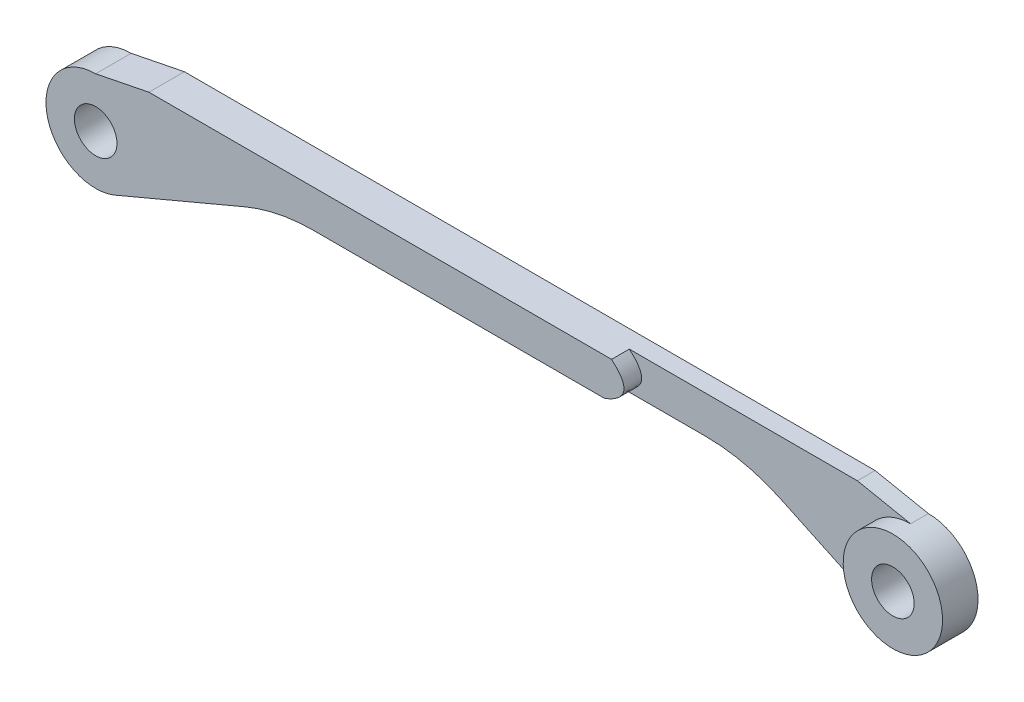
ISO-10303-21;
HEADER;
FILE_DESCRIPTION(('STEP AP214'),'2;1');
FILE_NAME('part.step','',(''),(''),'','','');
FILE_SCHEMA(('AUTOMOTIVE_DESIGN { 1 0 10303 214 1 1 1 1 }'));
ENDSEC;
DATA;
#1=APPLICATION_CONTEXT('core data for automotive mechanical design processes');
#2=APPLICATION_PROTOCOL_DEFINITION('international standard','automotive_design',2000,#1);
#3=PRODUCT_CONTEXT('',#1,'mechanical');
#4=PRODUCT('Part','Part','',(#3));
#5=PRODUCT_RELATED_PRODUCT_CATEGORY('part','',(#4));
#6=PRODUCT_DEFINITION_FORMATION('','',#4);
#7=PRODUCT_DEFINITION_CONTEXT('part definition',#1,'design');
#8=PRODUCT_DEFINITION('design','',#6,#7);
#9=PRODUCT_DEFINITION_SHAPE('','',#8);
#10=(LENGTH_UNIT() NAMED_UNIT(*) SI_UNIT(.MILLI.,.METRE.));
#11=(NAMED_UNIT(*) PLANE_ANGLE_UNIT() SI_UNIT($,.RADIAN.));
#12=(NAMED_UNIT(*) SI_UNIT($,.STERADIAN.) SOLID_ANGLE_UNIT());
#13=UNCERTAINTY_MEASURE_WITH_UNIT(LENGTH_MEASURE(1.E-05),#10,'distance_accuracy_value','');
#14=(GEOMETRIC_REPRESENTATION_CONTEXT(3) GLOBAL_UNCERTAINTY_ASSIGNED_CONTEXT((#13)) GLOBAL_UNIT_ASSIGNED_CONTEXT((#10,
#11,#12)) REPRESENTATION_CONTEXT('',''));
#15=CARTESIAN_POINT('',(0.,0.,0.));
#16=DIRECTION('',(0.,0.,1.));
#17=DIRECTION('',(1.,0.,0.));
#18=AXIS2_PLACEMENT_3D('',#15,#16,#17);
#19=CARTESIAN_POINT('',(-57.845130198065,-43.5295238724371,5.));
#20=DIRECTION('',(0.,0.,1.));
#21=DIRECTION('',(1.,0.,0.));
#22=AXIS2_PLACEMENT_3D('',#19,#20,#21);
#23=PLANE('',#22);
#24=DIRECTION('',(0.905027741446098,-0.425352544617962,0.));
#25=VECTOR('',#24,1.);
#26=CARTESIAN_POINT('',(-5.95493562465147,-12.6703883802454,5.));
#27=LINE('',#26,#25);
#28=CARTESIAN_POINT('',(-36.577502967167,1.7218631998678,5.));
#29=VERTEX_POINT('',#28);
#30=CARTESIAN_POINT('',(-5.95493562465147,-12.6703883802454,5.));
#31=VERTEX_POINT('',#30);
#32=EDGE_CURVE('E165',#29,#31,#27,.T.);
#33=ORIENTED_EDGE('',*,*,#32,.T.);
#34=CARTESIAN_POINT('',(0.,0.,5.));
#35=DIRECTION('',(0.,0.,1.));
#36=DIRECTION('',(1.,0.,0.));
#37=AXIS2_PLACEMENT_3D('',#34,#35,#36);
#38=CIRCLE('',#37,14.);
#39=CARTESIAN_POINT('',(0.,14.,5.));
#40=VERTEX_POINT('',#39);
#41=EDGE_CURVE('E147',#40,#31,#38,.T.);
#42=ORIENTED_EDGE('',*,*,#41,.F.);
#43=DIRECTION('',(-0.98058067569092,0.196116135138185,0.));
#44=VECTOR('',#43,1.);
#45=CARTESIAN_POINT('',(2.69230769230771,13.4615384615385,5.));
#46=LINE('',#45,#44);
#47=CARTESIAN_POINT('',(-15.,17.,5.));
#48=VERTEX_POINT('',#47);
#49=EDGE_CURVE('E157',#40,#48,#46,.T.);
#50=ORIENTED_EDGE('',*,*,#49,.T.);
#51=DIRECTION('',(-1.,0.,0.));
#52=VECTOR('',#51,1.);
#53=CARTESIAN_POINT('',(0.,17.,5.));
#54=LINE('',#53,#52);
#55=CARTESIAN_POINT('',(-79.2716069594435,17.,5.));
#56=VERTEX_POINT('',#55);
#57=EDGE_CURVE('E164',#48,#56,#54,.T.);
#58=ORIENTED_EDGE('',*,*,#57,.T.);
#59=CARTESIAN_POINT('',(-79.2716069594435,17.,5.));
#60=CARTESIAN_POINT('',(-71.4034946211549,10.2559083754016,5.));
#61=CARTESIAN_POINT('',(-81.2732419921328,6.47047612756292,5.));
#62=B_SPLINE_CURVE_WITH_KNOTS('',2,(#59,#60,#61),.UNSPECIFIED.,.F.,.F.,(3,3),(0.,1.),.UNSPECIFIED.);
#63=CARTESIAN_POINT('',(-81.2732419921328,6.47047612756292,5.));
#64=VERTEX_POINT('',#63);
#65=EDGE_CURVE('E191',#56,#64,#62,.T.);
#66=ORIENTED_EDGE('',*,*,#65,.T.);
#67=DIRECTION('',(1.,0.,0.));
#68=VECTOR('',#67,1.);
#69=CARTESIAN_POINT('',(0.,6.47047612756292,5.));
#70=LINE('',#69,#68);
#71=CARTESIAN_POINT('',(-57.845130198065,6.47047612756292,5.));
#72=VERTEX_POINT('',#71);
#73=EDGE_CURVE('E179',#64,#72,#70,.T.);
#74=ORIENTED_EDGE('',*,*,#73,.T.);
#75=CARTESIAN_POINT('',(-57.845130198065,-43.5295238724371,5.));
#76=DIRECTION('',(0.,0.,1.));
#77=DIRECTION('',(1.,0.,0.));
#78=AXIS2_PLACEMENT_3D('',#75,#76,#77);
#79=CIRCLE('',#78,50.);
#80=EDGE_CURVE('E183',#29,#72,#79,.T.);
#81=ORIENTED_EDGE('',*,*,#80,.F.);
#82=EDGE_LOOP('',(#33,#42,#50,#58,#66,#74,#81));
#83=FACE_BOUND('',#82,.T.);
#84=ADVANCED_FACE('F50',(#83),#23,.T.);
#85=CARTESIAN_POINT('',(-5.95493562465147,-12.6703883802454,10.));
#86=DIRECTION('',(0.425352544617962,0.905027741446098,0.));
#87=DIRECTION('',(-0.905027741446098,0.425352544617962,0.));
#88=AXIS2_PLACEMENT_3D('',#85,#86,#87);
#89=PLANE('',#88);
#90=ORIENTED_EDGE('',*,*,#32,.F.);
#91=DIRECTION('',(0.,0.,-1.));
#92=VECTOR('',#91,1.);
#93=CARTESIAN_POINT('',(-36.5775029671669,1.7218631998678,0.));
#94=LINE('',#93,#92);
#95=CARTESIAN_POINT('',(-36.577502967167,1.7218631998678,0.));
#96=VERTEX_POINT('',#95);
#97=EDGE_CURVE('E578',#29,#96,#94,.T.);
#98=ORIENTED_EDGE('',*,*,#97,.T.);
#99=DIRECTION('',(0.905027741446098,-0.425352544617962,0.));
#100=VECTOR('',#99,1.);
#101=CARTESIAN_POINT('',(-5.95493562465147,-12.6703883802454,0.));
#102=LINE('',#101,#100);
#103=CARTESIAN_POINT('',(-5.95493562465147,-12.6703883802454,0.));
#104=VERTEX_POINT('',#103);
#105=EDGE_CURVE('E508',#96,#104,#102,.T.);
#106=ORIENTED_EDGE('',*,*,#105,.T.);
#107=DIRECTION('',(0.,0.,-1.));
#108=VECTOR('',#107,1.);
#109=CARTESIAN_POINT('',(-5.95493562465147,-12.6703883802454,10.));
#110=LINE('',#109,#108);
#111=EDGE_CURVE('E153',#31,#104,#110,.T.);
#112=ORIENTED_EDGE('',*,*,#111,.F.);
#113=EDGE_LOOP('',(#90,#98,#106,#112));
#114=FACE_BOUND('',#113,.T.);
#115=ADVANCED_FACE('F253',(#114),#89,.F.);
#116=CARTESIAN_POINT('',(0.,0.,10.));
#117=DIRECTION('',(0.,0.,-1.));
#118=DIRECTION('',(-1.,0.,0.));
#119=AXIS2_PLACEMENT_3D('',#116,#117,#118);
#120=CYLINDRICAL_SURFACE('',#119,14.);
#121=DIRECTION('',(0.,0.,-1.));
#122=VECTOR('',#121,1.);
#123=CARTESIAN_POINT('',(0.,14.,10.));
#124=LINE('',#123,#122);
#125=CARTESIAN_POINT('',(0.,14.,0.));
#126=VERTEX_POINT('',#125);
#127=EDGE_CURVE('E141',#40,#126,#124,.T.);
#128=ORIENTED_EDGE('',*,*,#127,.F.);
#129=ORIENTED_EDGE('',*,*,#41,.T.);
#130=ORIENTED_EDGE('',*,*,#111,.T.);
#131=CARTESIAN_POINT('',(0.,0.,0.));
#132=DIRECTION('',(0.,0.,1.));
#133=DIRECTION('',(1.,0.,0.));
#134=AXIS2_PLACEMENT_3D('',#131,#132,#133);
#135=CIRCLE('',#134,14.);
#136=EDGE_CURVE('E149',#104,#126,#135,.T.);
#137=ORIENTED_EDGE('',*,*,#136,.T.);
#138=EDGE_LOOP('',(#128,#129,#130,#137));
#139=FACE_BOUND('',#138,.T.);
#140=CARTESIAN_POINT('',(0.,0.,10.));
#141=DIRECTION('',(0.,0.,1.));
#142=DIRECTION('',(1.,0.,0.));
#143=AXIS2_PLACEMENT_3D('',#140,#141,#142);
#144=CIRCLE('',#143,14.);
#145=CARTESIAN_POINT('',(14.,0.,10.));
#146=VERTEX_POINT('',#145);
#147=EDGE_CURVE('E175',#146,#146,#144,.T.);
#148=ORIENTED_EDGE('',*,*,#147,.F.);
#149=EDGE_LOOP('',(#148));
#150=FACE_BOUND('',#149,.T.);
#151=ADVANCED_FACE('F143',(#139,#150),#120,.T.);
#152=CARTESIAN_POINT('',(2.69230769230771,13.4615384615385,10.));
#153=DIRECTION('',(0.196116135138185,0.98058067569092,0.));
#154=DIRECTION('',(-0.98058067569092,0.196116135138185,0.));
#155=AXIS2_PLACEMENT_3D('',#152,#153,#154);
#156=PLANE('',#155);
#157=DIRECTION('',(0.,0.,-1.));
#158=VECTOR('',#157,1.);
#159=CARTESIAN_POINT('',(-15.,17.,10.));
#160=LINE('',#159,#158);
#161=CARTESIAN_POINT('',(-15.,17.,0.));
#162=VERTEX_POINT('',#161);
#163=EDGE_CURVE('E154',#48,#162,#160,.T.);
#164=ORIENTED_EDGE('',*,*,#163,.F.);
#165=ORIENTED_EDGE('',*,*,#49,.F.);
#166=ORIENTED_EDGE('',*,*,#127,.T.);
#167=DIRECTION('',(0.98058067569092,-0.196116135138185,0.));
#168=VECTOR('',#167,1.);
#169=CARTESIAN_POINT('',(2.69230769230771,13.4615384615385,0.));
#170=LINE('',#169,#168);
#171=EDGE_CURVE('E536',#162,#126,#170,.T.);
#172=ORIENTED_EDGE('',*,*,#171,.F.);
#173=EDGE_LOOP('',(#164,#165,#166,#172));
#174=FACE_BOUND('',#173,.T.);
#175=ADVANCED_FACE('F158',(#174),#156,.T.);
#176=CARTESIAN_POINT('',(0.,0.,10.));
#177=DIRECTION('',(0.,0.,-1.));
#178=DIRECTION('',(-1.,0.,0.));
#179=AXIS2_PLACEMENT_3D('',#176,#177,#178);
#180=CYLINDRICAL_SURFACE('',#179,6.);
#181=CARTESIAN_POINT('',(0.,0.,0.));
#182=DIRECTION('',(0.,0.,1.));
#183=DIRECTION('',(1.,0.,0.));
#184=AXIS2_PLACEMENT_3D('',#181,#182,#183);
#185=CIRCLE('',#184,6.);
#186=CARTESIAN_POINT('',(6.,0.,0.));
#187=VERTEX_POINT('',#186);
#188=EDGE_CURVE('E556',#187,#187,#185,.T.);
#189=ORIENTED_EDGE('',*,*,#188,.F.);
#190=EDGE_LOOP('',(#189));
#191=FACE_BOUND('',#190,.T.);
#192=CARTESIAN_POINT('',(0.,0.,10.));
#193=DIRECTION('',(0.,0.,1.));
#194=DIRECTION('',(1.,0.,0.));
#195=AXIS2_PLACEMENT_3D('',#192,#193,#194);
#196=CIRCLE('',#195,6.);
#197=CARTESIAN_POINT('',(6.,0.,10.));
#198=VERTEX_POINT('',#197);
#199=EDGE_CURVE('E170',#198,#198,#196,.F.);
#200=ORIENTED_EDGE('',*,*,#199,.F.);
#201=EDGE_LOOP('',(#200));
#202=FACE_BOUND('',#201,.T.);
#203=ADVANCED_FACE('F226',(#191,#202),#180,.F.);
#204=CARTESIAN_POINT('',(-57.845130198065,-43.5295238724371,10.));
#205=DIRECTION('',(0.,0.,1.));
#206=DIRECTION('',(1.,0.,0.));
#207=AXIS2_PLACEMENT_3D('',#204,#205,#206);
#208=CYLINDRICAL_SURFACE('',#207,50.);
#209=ORIENTED_EDGE('',*,*,#80,.T.);
#210=DIRECTION('',(0.,0.,-1.));
#211=VECTOR('',#210,1.);
#212=CARTESIAN_POINT('',(-57.845130198065,6.47047612756292,10.));
#213=LINE('',#212,#211);
#214=CARTESIAN_POINT('',(-57.845130198065,6.47047612756292,0.));
#215=VERTEX_POINT('',#214);
#216=EDGE_CURVE('E66',#215,#72,#213,.F.);
#217=ORIENTED_EDGE('',*,*,#216,.F.);
#218=CARTESIAN_POINT('',(-57.845130198065,-43.5295238724371,0.));
#219=DIRECTION('',(0.,0.,1.));
#220=DIRECTION('',(1.,0.,0.));
#221=AXIS2_PLACEMENT_3D('',#218,#219,#220);
#222=CIRCLE('',#221,50.);
#223=EDGE_CURVE('E591',#96,#215,#222,.T.);
#224=ORIENTED_EDGE('',*,*,#223,.F.);
#225=ORIENTED_EDGE('',*,*,#97,.F.);
#226=EDGE_LOOP('',(#209,#217,#224,#225));
#227=FACE_BOUND('',#226,.T.);
#228=ADVANCED_FACE('F229',(#227),#208,.F.);
#229=CARTESIAN_POINT('',(0.,17.,10.));
#230=DIRECTION('',(0.,1.,0.));
#231=DIRECTION('',(-1.,0.,0.));
#232=AXIS2_PLACEMENT_3D('',#229,#230,#231);
#233=PLANE('',#232);
#234=DIRECTION('',(0.,0.,1.));
#235=VECTOR('',#234,1.);
#236=CARTESIAN_POINT('',(-79.2716069594435,17.,5.));
#237=LINE('',#236,#235);
#238=CARTESIAN_POINT('',(-79.2716069594435,17.,10.));
#239=VERTEX_POINT('',#238);
#240=EDGE_CURVE('E198',#56,#239,#237,.T.);
#241=ORIENTED_EDGE('',*,*,#240,.F.);
#242=ORIENTED_EDGE('',*,*,#57,.F.);
#243=ORIENTED_EDGE('',*,*,#163,.T.);
#244=DIRECTION('',(1.,0.,0.));
#245=VECTOR('',#244,1.);
#246=CARTESIAN_POINT('',(0.,17.,0.));
#247=LINE('',#246,#245);
#248=CARTESIAN_POINT('',(-209.65,17.,0.));
#249=VERTEX_POINT('',#248);
#250=EDGE_CURVE('E539',#249,#162,#247,.T.);
#251=ORIENTED_EDGE('',*,*,#250,.F.);
#252=DIRECTION('',(0.,0.,-1.));
#253=VECTOR('',#252,1.);
#254=CARTESIAN_POINT('',(-209.65,17.,10.));
#255=LINE('',#254,#253);
#256=CARTESIAN_POINT('',(-209.65,17.,10.));
#257=VERTEX_POINT('',#256);
#258=EDGE_CURVE('E570',#257,#249,#255,.T.);
#259=ORIENTED_EDGE('',*,*,#258,.F.);
#260=DIRECTION('',(1.,0.,0.));
#261=VECTOR('',#260,1.);
#262=CARTESIAN_POINT('',(0.,17.,10.));
#263=LINE('',#262,#261);
#264=EDGE_CURVE('E516',#257,#239,#263,.T.);
#265=ORIENTED_EDGE('',*,*,#264,.T.);
#266=EDGE_LOOP('',(#241,#242,#243,#251,#259,#265));
#267=FACE_BOUND('',#266,.T.);
#268=ADVANCED_FACE('F244',(#267),#233,.T.);
#269=CARTESIAN_POINT('',(-11.3326923076922,56.6634615384613,10.));
#270=DIRECTION('',(0.196116135138183,-0.98058067569092,0.));
#271=DIRECTION('',(0.98058067569092,0.196116135138183,0.));
#272=AXIS2_PLACEMENT_3D('',#269,#270,#271);
#273=PLANE('',#272);
#274=DIRECTION('',(-0.98058067569092,-0.196116135138183,0.));
#275=VECTOR('',#274,1.);
#276=CARTESIAN_POINT('',(-11.3326923076922,56.6634615384613,0.));
#277=LINE('',#276,#275);
#278=CARTESIAN_POINT('',(-224.65,14.,0.));
#279=VERTEX_POINT('',#278);
#280=EDGE_CURVE('E542',#249,#279,#277,.T.);
#281=ORIENTED_EDGE('',*,*,#280,.T.);
#282=DIRECTION('',(0.,0.,-1.));
#283=VECTOR('',#282,1.);
#284=CARTESIAN_POINT('',(-224.65,14.,10.));
#285=LINE('',#284,#283);
#286=CARTESIAN_POINT('',(-224.65,14.,10.));
#287=VERTEX_POINT('',#286);
#288=EDGE_CURVE('E566',#287,#279,#285,.T.);
#289=ORIENTED_EDGE('',*,*,#288,.F.);
#290=DIRECTION('',(-0.98058067569092,-0.196116135138183,0.));
#291=VECTOR('',#290,1.);
#292=CARTESIAN_POINT('',(-11.3326923076922,56.6634615384613,10.));
#293=LINE('',#292,#291);
#294=EDGE_CURVE('E519',#257,#287,#293,.T.);
#295=ORIENTED_EDGE('',*,*,#294,.F.);
#296=ORIENTED_EDGE('',*,*,#258,.T.);
#297=EDGE_LOOP('',(#281,#289,#295,#296));
#298=FACE_BOUND('',#297,.T.);
#299=ADVANCED_FACE('F240',(#298),#273,.F.);
#300=CARTESIAN_POINT('',(-224.65,0.,10.));
#301=DIRECTION('',(0.,0.,-1.));
#302=DIRECTION('',(-1.,0.,0.));
#303=AXIS2_PLACEMENT_3D('',#300,#301,#302);
#304=CYLINDRICAL_SURFACE('',#303,14.);
#305=CARTESIAN_POINT('',(-224.65,0.,0.));
#306=DIRECTION('',(0.,0.,1.));
#307=DIRECTION('',(1.,0.,0.));
#308=AXIS2_PLACEMENT_3D('',#305,#306,#307);
#309=CIRCLE('',#308,14.);
#310=CARTESIAN_POINT('',(-219.205808477167,-12.8980920551341,0.));
#311=VERTEX_POINT('',#310);
#312=EDGE_CURVE('E546',#279,#311,#309,.T.);
#313=ORIENTED_EDGE('',*,*,#312,.T.);
#314=DIRECTION('',(0.,0.,-1.));
#315=VECTOR('',#314,1.);
#316=CARTESIAN_POINT('',(-219.205808477167,-12.8980920551341,10.));
#317=LINE('',#316,#315);
#318=CARTESIAN_POINT('',(-219.205808477167,-12.8980920551341,10.));
#319=VERTEX_POINT('',#318);
#320=EDGE_CURVE('E532',#319,#311,#317,.T.);
#321=ORIENTED_EDGE('',*,*,#320,.F.);
#322=CARTESIAN_POINT('',(-224.65,0.,10.));
#323=DIRECTION('',(0.,0.,1.));
#324=DIRECTION('',(1.,0.,0.));
#325=AXIS2_PLACEMENT_3D('',#322,#323,#324);
#326=CIRCLE('',#325,14.);
#327=EDGE_CURVE('E524',#287,#319,#326,.T.);
#328=ORIENTED_EDGE('',*,*,#327,.F.);
#329=ORIENTED_EDGE('',*,*,#288,.T.);
#330=EDGE_LOOP('',(#313,#321,#328,#329));
#331=FACE_BOUND('',#330,.T.);
#332=ADVANCED_FACE('F236',(#331),#304,.T.);
#333=CARTESIAN_POINT('',(-28.527497627278,67.5858461180238,10.));
#334=DIRECTION('',(0.38887082305951,-0.921292289652431,0.));
#335=DIRECTION('',(0.921292289652431,0.38887082305951,0.));
#336=AXIS2_PLACEMENT_3D('',#333,#334,#335);
#337=PLANE('',#336);
#338=DIRECTION('',(-0.921292289652431,-0.38887082305951,0.));
#339=VECTOR('',#338,1.);
#340=CARTESIAN_POINT('',(-28.527497627278,67.5858461180238,0.));
#341=LINE('',#340,#339);
#342=CARTESIAN_POINT('',(-182.642324278252,2.53509061018449,0.));
#343=VERTEX_POINT('',#342);
#344=EDGE_CURVE('E550',#343,#311,#341,.T.);
#345=ORIENTED_EDGE('',*,*,#344,.F.);
#346=DIRECTION('',(0.,0.,-1.));
#347=VECTOR('',#346,1.);
#348=CARTESIAN_POINT('',(-182.642324278252,2.53509061018448,10.));
#349=LINE('',#348,#347);
#350=CARTESIAN_POINT('',(-182.642324278252,2.53509061018449,10.));
#351=VERTEX_POINT('',#350);
#352=EDGE_CURVE('E587',#343,#351,#349,.F.);
#353=ORIENTED_EDGE('',*,*,#352,.T.);
#354=DIRECTION('',(-0.921292289652431,-0.38887082305951,0.));
#355=VECTOR('',#354,1.);
#356=CARTESIAN_POINT('',(-28.527497627278,67.5858461180238,10.));
#357=LINE('',#356,#355);
#358=EDGE_CURVE('E505',#351,#319,#357,.T.);
#359=ORIENTED_EDGE('',*,*,#358,.T.);
#360=ORIENTED_EDGE('',*,*,#320,.T.);
#361=EDGE_LOOP('',(#345,#353,#359,#360));
#362=FACE_BOUND('',#361,.T.);
#363=ADVANCED_FACE('F233',(#362),#337,.T.);
#364=CARTESIAN_POINT('',(0.,6.47047612756292,10.));
#365=DIRECTION('',(0.,1.,0.));
#366=DIRECTION('',(-1.,0.,0.));
#367=AXIS2_PLACEMENT_3D('',#364,#365,#366);
#368=PLANE('',#367);
#369=ORIENTED_EDGE('',*,*,#73,.F.);
#370=DIRECTION('',(0.,0.,1.));
#371=VECTOR('',#370,1.);
#372=CARTESIAN_POINT('',(-81.2732419921328,6.47047612756292,5.));
#373=LINE('',#372,#371);
#374=CARTESIAN_POINT('',(-81.2732419921328,6.47047612756292,10.));
#375=VERTEX_POINT('',#374);
#376=EDGE_CURVE('E496',#64,#375,#373,.T.);
#377=ORIENTED_EDGE('',*,*,#376,.T.);
#378=DIRECTION('',(1.,0.,0.));
#379=VECTOR('',#378,1.);
#380=CARTESIAN_POINT('',(0.,6.47047612756292,10.));
#381=LINE('',#380,#379);
#382=CARTESIAN_POINT('',(-163.198783125276,6.47047612756292,10.));
#383=VERTEX_POINT('',#382);
#384=EDGE_CURVE('E500',#383,#375,#381,.T.);
#385=ORIENTED_EDGE('',*,*,#384,.F.);
#386=DIRECTION('',(0.,0.,-1.));
#387=VECTOR('',#386,1.);
#388=CARTESIAN_POINT('',(-163.198783125276,6.47047612756292,10.));
#389=LINE('',#388,#387);
#390=CARTESIAN_POINT('',(-163.198783125276,6.47047612756292,0.));
#391=VERTEX_POINT('',#390);
#392=EDGE_CURVE('E582',#383,#391,#389,.T.);
#393=ORIENTED_EDGE('',*,*,#392,.T.);
#394=DIRECTION('',(1.,0.,0.));
#395=VECTOR('',#394,1.);
#396=CARTESIAN_POINT('',(0.,6.47047612756292,0.));
#397=LINE('',#396,#395);
#398=EDGE_CURVE('E553',#391,#215,#397,.T.);
#399=ORIENTED_EDGE('',*,*,#398,.T.);
#400=ORIENTED_EDGE('',*,*,#216,.T.);
#401=EDGE_LOOP('',(#369,#377,#385,#393,#399,#400));
#402=FACE_BOUND('',#401,.T.);
#403=ADVANCED_FACE('F224',(#402),#368,.F.);
#404=CARTESIAN_POINT('',(-224.65,0.,10.));
#405=DIRECTION('',(0.,0.,-1.));
#406=DIRECTION('',(-1.,0.,0.));
#407=AXIS2_PLACEMENT_3D('',#404,#405,#406);
#408=CYLINDRICAL_SURFACE('',#407,5.99999999999999);
#409=CARTESIAN_POINT('',(-224.65,0.,10.));
#410=DIRECTION('',(0.,0.,1.));
#411=DIRECTION('',(1.,0.,0.));
#412=AXIS2_PLACEMENT_3D('',#409,#410,#411);
#413=CIRCLE('',#412,5.99999999999999);
#414=CARTESIAN_POINT('',(-218.65,0.,10.));
#415=VERTEX_POINT('',#414);
#416=EDGE_CURVE('E504',#415,#415,#413,.T.);
#417=ORIENTED_EDGE('',*,*,#416,.T.);
#418=EDGE_LOOP('',(#417));
#419=FACE_BOUND('',#418,.T.);
#420=CARTESIAN_POINT('',(-224.65,0.,0.));
#421=DIRECTION('',(0.,0.,1.));
#422=DIRECTION('',(1.,0.,0.));
#423=AXIS2_PLACEMENT_3D('',#420,#421,#422);
#424=CIRCLE('',#423,5.99999999999999);
#425=CARTESIAN_POINT('',(-218.65,0.,0.));
#426=VERTEX_POINT('',#425);
#427=EDGE_CURVE('E520',#426,#426,#424,.T.);
#428=ORIENTED_EDGE('',*,*,#427,.F.);
#429=EDGE_LOOP('',(#428));
#430=FACE_BOUND('',#429,.T.);
#431=ADVANCED_FACE('F217',(#419,#430),#408,.F.);
#432=CARTESIAN_POINT('',(0.,0.,10.));
#433=DIRECTION('',(0.,0.,1.));
#434=DIRECTION('',(1.,0.,0.));
#435=AXIS2_PLACEMENT_3D('',#432,#433,#434);
#436=PLANE('',#435);
#437=CARTESIAN_POINT('',(-79.2716069594435,17.,10.));
#438=CARTESIAN_POINT('',(-71.4034946211549,10.2559083754016,10.));
#439=CARTESIAN_POINT('',(-81.2732419921328,6.47047612756292,10.));
#440=B_SPLINE_CURVE_WITH_KNOTS('',2,(#437,#438,#439),.UNSPECIFIED.,.F.,.F.,(3,3),(0.,1.),.UNSPECIFIED.);
#441=EDGE_CURVE('E184',#239,#375,#440,.T.);
#442=ORIENTED_EDGE('',*,*,#441,.F.);
#443=ORIENTED_EDGE('',*,*,#264,.F.);
#444=ORIENTED_EDGE('',*,*,#294,.T.);
#445=ORIENTED_EDGE('',*,*,#327,.T.);
#446=ORIENTED_EDGE('',*,*,#358,.F.);
#447=CARTESIAN_POINT('',(-163.198783125276,-43.5295238724371,10.));
#448=DIRECTION('',(0.,0.,1.));
#449=DIRECTION('',(1.,0.,0.));
#450=AXIS2_PLACEMENT_3D('',#447,#448,#449);
#451=CIRCLE('',#450,50.);
#452=EDGE_CURVE('E11',#351,#383,#451,.F.);
#453=ORIENTED_EDGE('',*,*,#452,.T.);
#454=ORIENTED_EDGE('',*,*,#384,.T.);
#455=EDGE_LOOP('',(#442,#443,#444,#445,#446,#453,#454));
#456=FACE_BOUND('',#455,.T.);
#457=ORIENTED_EDGE('',*,*,#416,.F.);
#458=EDGE_LOOP('',(#457));
#459=FACE_BOUND('',#458,.T.);
#460=ADVANCED_FACE('F213',(#456,#459),#436,.T.);
#461=CARTESIAN_POINT('',(0.,0.,0.));
#462=DIRECTION('',(0.,0.,1.));
#463=DIRECTION('',(1.,0.,0.));
#464=AXIS2_PLACEMENT_3D('',#461,#462,#463);
#465=PLANE('',#464);
#466=ORIENTED_EDGE('',*,*,#105,.F.);
#467=ORIENTED_EDGE('',*,*,#223,.T.);
#468=ORIENTED_EDGE('',*,*,#398,.F.);
#469=CARTESIAN_POINT('',(-163.198783125276,-43.5295238724371,0.));
#470=DIRECTION('',(0.,0.,1.));
#471=DIRECTION('',(1.,0.,0.));
#472=AXIS2_PLACEMENT_3D('',#469,#470,#471);
#473=CIRCLE('',#472,50.);
#474=EDGE_CURVE('E59',#391,#343,#473,.T.);
#475=ORIENTED_EDGE('',*,*,#474,.T.);
#476=ORIENTED_EDGE('',*,*,#344,.T.);
#477=ORIENTED_EDGE('',*,*,#312,.F.);
#478=ORIENTED_EDGE('',*,*,#280,.F.);
#479=ORIENTED_EDGE('',*,*,#250,.T.);
#480=ORIENTED_EDGE('',*,*,#171,.T.);
#481=ORIENTED_EDGE('',*,*,#136,.F.);
#482=EDGE_LOOP('',(#466,#467,#468,#475,#476,#477,#478,#479,#480,#481));
#483=FACE_BOUND('',#482,.T.);
#484=ORIENTED_EDGE('',*,*,#188,.T.);
#485=EDGE_LOOP('',(#484));
#486=FACE_BOUND('',#485,.T.);
#487=ORIENTED_EDGE('',*,*,#427,.T.);
#488=EDGE_LOOP('',(#487));
#489=FACE_BOUND('',#488,.T.);
#490=ADVANCED_FACE('F216',(#483,#486,#489),#465,.F.);
#491=CARTESIAN_POINT('',(-163.198783125276,-43.5295238724371,10.));
#492=DIRECTION('',(0.,0.,-1.));
#493=DIRECTION('',(-1.,0.,0.));
#494=AXIS2_PLACEMENT_3D('',#491,#492,#493);
#495=CYLINDRICAL_SURFACE('',#494,50.);
#496=ORIENTED_EDGE('',*,*,#452,.F.);
#497=ORIENTED_EDGE('',*,*,#352,.F.);
#498=ORIENTED_EDGE('',*,*,#474,.F.);
#499=ORIENTED_EDGE('',*,*,#392,.F.);
#500=EDGE_LOOP('',(#496,#497,#498,#499));
#501=FACE_BOUND('',#500,.T.);
#502=ADVANCED_FACE('F52',(#501),#495,.F.);
#503=DIRECTION('',(0.,0.,1.));
#504=VECTOR('',#503,1.);
#505=SURFACE_OF_LINEAR_EXTRUSION('',#62,#504);
#506=ORIENTED_EDGE('',*,*,#441,.T.);
#507=ORIENTED_EDGE('',*,*,#376,.F.);
#508=ORIENTED_EDGE('',*,*,#65,.F.);
#509=ORIENTED_EDGE('',*,*,#240,.T.);
#510=EDGE_LOOP('',(#506,#507,#508,#509));
#511=FACE_BOUND('',#510,.T.);
#512=ADVANCED_FACE('F206',(#511),#505,.F.);
#513=CARTESIAN_POINT('',(0.,0.,10.));
#514=DIRECTION('',(0.,0.,1.));
#515=DIRECTION('',(1.,0.,0.));
#516=AXIS2_PLACEMENT_3D('',#513,#514,#515);
#517=PLANE('',#516);
#518=ORIENTED_EDGE('',*,*,#199,.T.);
#519=EDGE_LOOP('',(#518));
#520=FACE_BOUND('',#519,.T.);
#521=ORIENTED_EDGE('',*,*,#147,.T.);
#522=EDGE_LOOP('',(#521));
#523=FACE_BOUND('',#522,.T.);
#524=ADVANCED_FACE('F210',(#520,#523),#517,.T.);
#525=CLOSED_SHELL('',(#84,#115,#151,#175,#203,#228,#268,#299,#332,#363,#403,#431,#460,#490,#502,
#512,#524));
#526=MANIFOLD_SOLID_BREP('B2',#525);
#527=ADVANCED_BREP_SHAPE_REPRESENTATION('',(#18,#526),#14);
#528=SHAPE_DEFINITION_REPRESENTATION(#9,#527);
ENDSEC;
END-ISO-10303-21;
